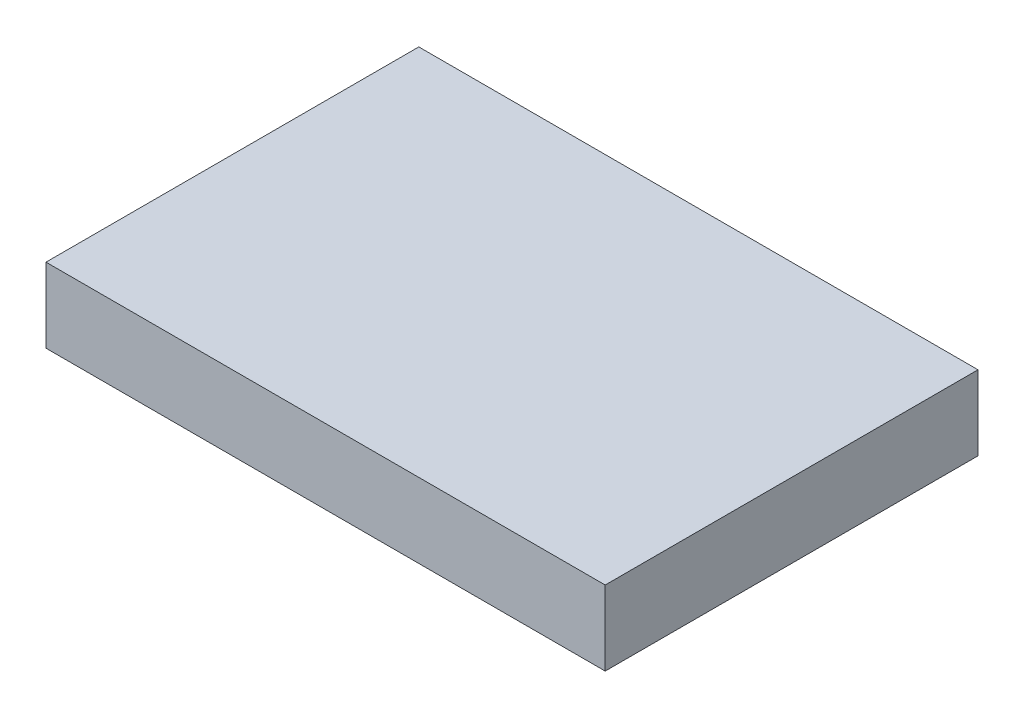
ISO-10303-21;
HEADER;
FILE_DESCRIPTION(('STEP AP214'),'2;1');
FILE_NAME('part.step','',(''),(''),'','','');
FILE_SCHEMA(('AUTOMOTIVE_DESIGN { 1 0 10303 214 1 1 1 1 }'));
ENDSEC;
DATA;
#1=APPLICATION_CONTEXT('core data for automotive mechanical design processes');
#2=APPLICATION_PROTOCOL_DEFINITION('international standard','automotive_design',2000,#1);
#3=PRODUCT_CONTEXT('',#1,'mechanical');
#4=PRODUCT('Part','Part','',(#3));
#5=PRODUCT_RELATED_PRODUCT_CATEGORY('part','',(#4));
#6=PRODUCT_DEFINITION_FORMATION('','',#4);
#7=PRODUCT_DEFINITION_CONTEXT('part definition',#1,'design');
#8=PRODUCT_DEFINITION('design','',#6,#7);
#9=PRODUCT_DEFINITION_SHAPE('','',#8);
#10=(LENGTH_UNIT() NAMED_UNIT(*) SI_UNIT(.MILLI.,.METRE.));
#11=(NAMED_UNIT(*) PLANE_ANGLE_UNIT() SI_UNIT($,.RADIAN.));
#12=(NAMED_UNIT(*) SI_UNIT($,.STERADIAN.) SOLID_ANGLE_UNIT());
#13=UNCERTAINTY_MEASURE_WITH_UNIT(LENGTH_MEASURE(1.E-05),#10,'distance_accuracy_value','');
#14=(GEOMETRIC_REPRESENTATION_CONTEXT(3) GLOBAL_UNCERTAINTY_ASSIGNED_CONTEXT((#13)) GLOBAL_UNIT_ASSIGNED_CONTEXT((#10,
#11,#12)) REPRESENTATION_CONTEXT('',''));
#15=CARTESIAN_POINT('',(0.,0.,0.));
#16=DIRECTION('',(0.,0.,1.));
#17=DIRECTION('',(1.,0.,0.));
#18=AXIS2_PLACEMENT_3D('',#15,#16,#17);
#19=CARTESIAN_POINT('',(37.5,10.,-25.));
#20=DIRECTION('',(-1.,0.,0.));
#21=DIRECTION('',(0.,0.,1.));
#22=AXIS2_PLACEMENT_3D('',#19,#20,#21);
#23=PLANE('',#22);
#24=DIRECTION('',(0.,0.,-1.));
#25=VECTOR('',#24,1.);
#26=CARTESIAN_POINT('',(37.5,0.,-25.));
#27=LINE('',#26,#25);
#28=CARTESIAN_POINT('',(37.5,0.,25.));
#29=VERTEX_POINT('',#28);
#30=CARTESIAN_POINT('',(37.5,0.,-25.));
#31=VERTEX_POINT('',#30);
#32=EDGE_CURVE('E105',#29,#31,#27,.T.);
#33=ORIENTED_EDGE('',*,*,#32,.T.);
#34=DIRECTION('',(0.,-1.,0.));
#35=VECTOR('',#34,1.);
#36=CARTESIAN_POINT('',(37.5,10.,-25.));
#37=LINE('',#36,#35);
#38=CARTESIAN_POINT('',(37.5,10.,-25.));
#39=VERTEX_POINT('',#38);
#40=EDGE_CURVE('E11',#39,#31,#37,.T.);
#41=ORIENTED_EDGE('',*,*,#40,.F.);
#42=DIRECTION('',(0.,0.,-1.));
#43=VECTOR('',#42,1.);
#44=CARTESIAN_POINT('',(37.5,10.,-25.));
#45=LINE('',#44,#43);
#46=CARTESIAN_POINT('',(37.5,10.,25.));
#47=VERTEX_POINT('',#46);
#48=EDGE_CURVE('E93',#47,#39,#45,.T.);
#49=ORIENTED_EDGE('',*,*,#48,.F.);
#50=DIRECTION('',(0.,-1.,0.));
#51=VECTOR('',#50,1.);
#52=CARTESIAN_POINT('',(37.5,10.,25.));
#53=LINE('',#52,#51);
#54=EDGE_CURVE('E101',#47,#29,#53,.T.);
#55=ORIENTED_EDGE('',*,*,#54,.T.);
#56=EDGE_LOOP('',(#33,#41,#49,#55));
#57=FACE_BOUND('',#56,.T.);
#58=ADVANCED_FACE('F42',(#57),#23,.F.);
#59=CARTESIAN_POINT('',(-37.5,10.,-25.));
#60=DIRECTION('',(0.,0.,1.));
#61=DIRECTION('',(1.,0.,0.));
#62=AXIS2_PLACEMENT_3D('',#59,#60,#61);
#63=PLANE('',#62);
#64=DIRECTION('',(-1.,0.,0.));
#65=VECTOR('',#64,1.);
#66=CARTESIAN_POINT('',(-37.5,0.,-25.));
#67=LINE('',#66,#65);
#68=CARTESIAN_POINT('',(-37.5,0.,-25.));
#69=VERTEX_POINT('',#68);
#70=EDGE_CURVE('E97',#31,#69,#67,.T.);
#71=ORIENTED_EDGE('',*,*,#70,.T.);
#72=DIRECTION('',(0.,-1.,0.));
#73=VECTOR('',#72,1.);
#74=CARTESIAN_POINT('',(-37.5,10.,-25.));
#75=LINE('',#74,#73);
#76=CARTESIAN_POINT('',(-37.5,10.,-25.));
#77=VERTEX_POINT('',#76);
#78=EDGE_CURVE('E50',#77,#69,#75,.T.);
#79=ORIENTED_EDGE('',*,*,#78,.F.);
#80=DIRECTION('',(-1.,0.,0.));
#81=VECTOR('',#80,1.);
#82=CARTESIAN_POINT('',(-37.5,10.,-25.));
#83=LINE('',#82,#81);
#84=EDGE_CURVE('E88',#39,#77,#83,.T.);
#85=ORIENTED_EDGE('',*,*,#84,.F.);
#86=ORIENTED_EDGE('',*,*,#40,.T.);
#87=EDGE_LOOP('',(#71,#79,#85,#86));
#88=FACE_BOUND('',#87,.T.);
#89=ADVANCED_FACE('F96',(#88),#63,.F.);
#90=CARTESIAN_POINT('',(-37.5,10.,-25.));
#91=DIRECTION('',(1.,0.,0.));
#92=DIRECTION('',(0.,0.,-1.));
#93=AXIS2_PLACEMENT_3D('',#90,#91,#92);
#94=PLANE('',#93);
#95=DIRECTION('',(0.,0.,1.));
#96=VECTOR('',#95,1.);
#97=CARTESIAN_POINT('',(-37.5,0.,-25.));
#98=LINE('',#97,#96);
#99=CARTESIAN_POINT('',(-37.5,0.,25.));
#100=VERTEX_POINT('',#99);
#101=EDGE_CURVE('E75',#69,#100,#98,.T.);
#102=ORIENTED_EDGE('',*,*,#101,.T.);
#103=DIRECTION('',(0.,-1.,0.));
#104=VECTOR('',#103,1.);
#105=CARTESIAN_POINT('',(-37.5,10.,25.));
#106=LINE('',#105,#104);
#107=CARTESIAN_POINT('',(-37.5,10.,25.));
#108=VERTEX_POINT('',#107);
#109=EDGE_CURVE('E98',#108,#100,#106,.T.);
#110=ORIENTED_EDGE('',*,*,#109,.F.);
#111=DIRECTION('',(0.,0.,1.));
#112=VECTOR('',#111,1.);
#113=CARTESIAN_POINT('',(-37.5,10.,-25.));
#114=LINE('',#113,#112);
#115=EDGE_CURVE('E91',#77,#108,#114,.T.);
#116=ORIENTED_EDGE('',*,*,#115,.F.);
#117=ORIENTED_EDGE('',*,*,#78,.T.);
#118=EDGE_LOOP('',(#102,#110,#116,#117));
#119=FACE_BOUND('',#118,.T.);
#120=ADVANCED_FACE('F99',(#119),#94,.F.);
#121=CARTESIAN_POINT('',(-37.5,10.,25.));
#122=DIRECTION('',(0.,0.,-1.));
#123=DIRECTION('',(-1.,0.,0.));
#124=AXIS2_PLACEMENT_3D('',#121,#122,#123);
#125=PLANE('',#124);
#126=DIRECTION('',(1.,0.,0.));
#127=VECTOR('',#126,1.);
#128=CARTESIAN_POINT('',(-37.5,0.,25.));
#129=LINE('',#128,#127);
#130=EDGE_CURVE('E81',#100,#29,#129,.T.);
#131=ORIENTED_EDGE('',*,*,#130,.T.);
#132=ORIENTED_EDGE('',*,*,#54,.F.);
#133=DIRECTION('',(1.,0.,0.));
#134=VECTOR('',#133,1.);
#135=CARTESIAN_POINT('',(-37.5,10.,25.));
#136=LINE('',#135,#134);
#137=EDGE_CURVE('E58',#108,#47,#136,.T.);
#138=ORIENTED_EDGE('',*,*,#137,.F.);
#139=ORIENTED_EDGE('',*,*,#109,.T.);
#140=EDGE_LOOP('',(#131,#132,#138,#139));
#141=FACE_BOUND('',#140,.T.);
#142=ADVANCED_FACE('F112',(#141),#125,.F.);
#143=CARTESIAN_POINT('',(0.,10.,0.));
#144=DIRECTION('',(0.,1.,0.));
#145=DIRECTION('',(0.,0.,1.));
#146=AXIS2_PLACEMENT_3D('',#143,#144,#145);
#147=PLANE('',#146);
#148=ORIENTED_EDGE('',*,*,#48,.T.);
#149=ORIENTED_EDGE('',*,*,#84,.T.);
#150=ORIENTED_EDGE('',*,*,#115,.T.);
#151=ORIENTED_EDGE('',*,*,#137,.T.);
#152=EDGE_LOOP('',(#148,#149,#150,#151));
#153=FACE_BOUND('',#152,.T.);
#154=ADVANCED_FACE('F89',(#153),#147,.T.);
#155=CARTESIAN_POINT('',(0.,0.,0.));
#156=DIRECTION('',(0.,1.,0.));
#157=DIRECTION('',(0.,0.,1.));
#158=AXIS2_PLACEMENT_3D('',#155,#156,#157);
#159=PLANE('',#158);
#160=ORIENTED_EDGE('',*,*,#32,.F.);
#161=ORIENTED_EDGE('',*,*,#130,.F.);
#162=ORIENTED_EDGE('',*,*,#101,.F.);
#163=ORIENTED_EDGE('',*,*,#70,.F.);
#164=EDGE_LOOP('',(#160,#161,#162,#163));
#165=FACE_BOUND('',#164,.T.);
#166=ADVANCED_FACE('F115',(#165),#159,.F.);
#167=CLOSED_SHELL('',(#58,#89,#120,#142,#154,#166));
#168=MANIFOLD_SOLID_BREP('B2',#167);
#169=ADVANCED_BREP_SHAPE_REPRESENTATION('',(#18,#168),#14);
#170=SHAPE_DEFINITION_REPRESENTATION(#9,#169);
ENDSEC;
END-ISO-10303-21;
